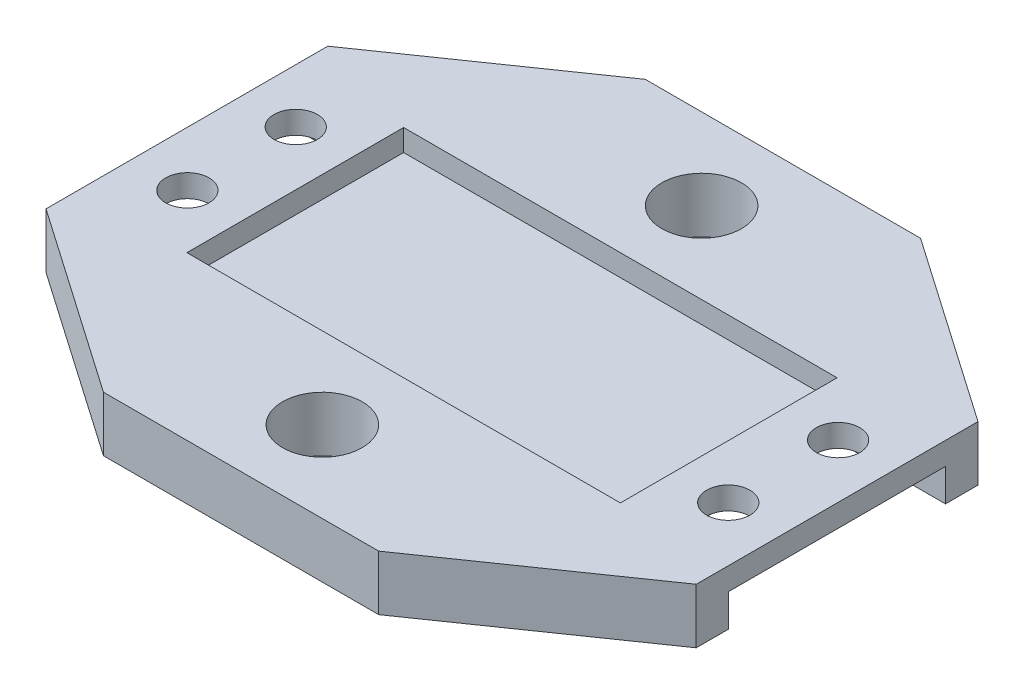
ISO-10303-21;
HEADER;
FILE_DESCRIPTION(('STEP AP214'),'2;1');
FILE_NAME('part.step','',(''),(''),'','','');
FILE_SCHEMA(('AUTOMOTIVE_DESIGN { 1 0 10303 214 1 1 1 1 }'));
ENDSEC;
DATA;
#1=APPLICATION_CONTEXT('core data for automotive mechanical design processes');
#2=APPLICATION_PROTOCOL_DEFINITION('international standard','automotive_design',2000,#1);
#3=PRODUCT_CONTEXT('',#1,'mechanical');
#4=PRODUCT('Part','Part','',(#3));
#5=PRODUCT_RELATED_PRODUCT_CATEGORY('part','',(#4));
#6=PRODUCT_DEFINITION_FORMATION('','',#4);
#7=PRODUCT_DEFINITION_CONTEXT('part definition',#1,'design');
#8=PRODUCT_DEFINITION('design','',#6,#7);
#9=PRODUCT_DEFINITION_SHAPE('','',#8);
#10=(LENGTH_UNIT() NAMED_UNIT(*) SI_UNIT(.MILLI.,.METRE.));
#11=(NAMED_UNIT(*) PLANE_ANGLE_UNIT() SI_UNIT($,.RADIAN.));
#12=(NAMED_UNIT(*) SI_UNIT($,.STERADIAN.) SOLID_ANGLE_UNIT());
#13=UNCERTAINTY_MEASURE_WITH_UNIT(LENGTH_MEASURE(1.E-05),#10,'distance_accuracy_value','');
#14=(GEOMETRIC_REPRESENTATION_CONTEXT(3) GLOBAL_UNCERTAINTY_ASSIGNED_CONTEXT((#13)) GLOBAL_UNIT_ASSIGNED_CONTEXT((#10,
#11,#12)) REPRESENTATION_CONTEXT('',''));
#15=CARTESIAN_POINT('',(0.,0.,0.));
#16=DIRECTION('',(0.,0.,1.));
#17=DIRECTION('',(1.,0.,0.));
#18=AXIS2_PLACEMENT_3D('',#15,#16,#17);
#19=CARTESIAN_POINT('',(-48.0586840471915,5.08,-27.2267854013535));
#20=DIRECTION('',(1.,0.,0.));
#21=DIRECTION('',(0.,0.,-1.));
#22=AXIS2_PLACEMENT_3D('',#19,#20,#21);
#23=PLANE('',#22);
#24=DIRECTION('',(0.,0.,-1.));
#25=VECTOR('',#24,1.);
#26=CARTESIAN_POINT('',(-48.0586840471915,3.,7.81499333051671));
#27=LINE('',#26,#25);
#28=CARTESIAN_POINT('',(-48.0586840471915,3.,7.81499333051671));
#29=VERTEX_POINT('',#28);
#30=CARTESIAN_POINT('',(-48.0586840471915,3.,-12.1850066694833));
#31=VERTEX_POINT('',#30);
#32=EDGE_CURVE('E257',#29,#31,#27,.T.);
#33=ORIENTED_EDGE('',*,*,#32,.F.);
#34=DIRECTION('',(0.,1.,0.));
#35=VECTOR('',#34,1.);
#36=CARTESIAN_POINT('',(-48.0586840471915,0.,7.81499333051671));
#37=LINE('',#36,#35);
#38=CARTESIAN_POINT('',(-48.0586840471915,0.,7.81499333051671));
#39=VERTEX_POINT('',#38);
#40=EDGE_CURVE('E235',#39,#29,#37,.T.);
#41=ORIENTED_EDGE('',*,*,#40,.F.);
#42=DIRECTION('',(0.,0.,1.));
#43=VECTOR('',#42,1.);
#44=CARTESIAN_POINT('',(-48.0586840471915,0.,-27.2267854013535));
#45=LINE('',#44,#43);
#46=CARTESIAN_POINT('',(-48.0586840471915,0.,10.7732145986465));
#47=VERTEX_POINT('',#46);
#48=EDGE_CURVE('E319',#39,#47,#45,.T.);
#49=ORIENTED_EDGE('',*,*,#48,.T.);
#50=DIRECTION('',(0.,1.,0.));
#51=VECTOR('',#50,1.);
#52=CARTESIAN_POINT('',(-48.0586840471915,0.,10.7732145986465));
#53=LINE('',#52,#51);
#54=CARTESIAN_POINT('',(-48.0586840471915,5.08,10.7732145986465));
#55=VERTEX_POINT('',#54);
#56=EDGE_CURVE('E306',#47,#55,#53,.T.);
#57=ORIENTED_EDGE('',*,*,#56,.T.);
#58=DIRECTION('',(0.,0.,1.));
#59=VECTOR('',#58,1.);
#60=CARTESIAN_POINT('',(-48.0586840471915,5.08,-27.2267854013535));
#61=LINE('',#60,#59);
#62=CARTESIAN_POINT('',(-48.0586840471915,5.08,-15.2267854013535));
#63=VERTEX_POINT('',#62);
#64=EDGE_CURVE('E322',#63,#55,#61,.T.);
#65=ORIENTED_EDGE('',*,*,#64,.F.);
#66=DIRECTION('',(0.,1.,0.));
#67=VECTOR('',#66,1.);
#68=CARTESIAN_POINT('',(-48.0586840471915,0.,-15.2267854013535));
#69=LINE('',#68,#67);
#70=CARTESIAN_POINT('',(-48.0586840471915,0.,-15.2267854013535));
#71=VERTEX_POINT('',#70);
#72=EDGE_CURVE('E279',#71,#63,#69,.T.);
#73=ORIENTED_EDGE('',*,*,#72,.F.);
#74=CARTESIAN_POINT('',(-48.0586840471915,0.,-12.1850066694833));
#75=VERTEX_POINT('',#74);
#76=EDGE_CURVE('E331',#71,#75,#45,.T.);
#77=ORIENTED_EDGE('',*,*,#76,.T.);
#78=DIRECTION('',(0.,-1.,0.));
#79=VECTOR('',#78,1.);
#80=CARTESIAN_POINT('',(-48.0586840471915,0.,-12.1850066694833));
#81=LINE('',#80,#79);
#82=EDGE_CURVE('E246',#31,#75,#81,.T.);
#83=ORIENTED_EDGE('',*,*,#82,.F.);
#84=EDGE_LOOP('',(#33,#41,#49,#57,#65,#73,#77,#83));
#85=FACE_BOUND('',#84,.T.);
#86=ADVANCED_FACE('F34',(#85),#23,.F.);
#87=CARTESIAN_POINT('',(-48.0586840471915,5.08,22.7732145986465));
#88=DIRECTION('',(0.,0.,-1.));
#89=DIRECTION('',(-1.,0.,0.));
#90=AXIS2_PLACEMENT_3D('',#87,#88,#89);
#91=PLANE('',#90);
#92=DIRECTION('',(0.,1.,0.));
#93=VECTOR('',#92,1.);
#94=CARTESIAN_POINT('',(-5.35868404719149,0.,22.7732145986465));
#95=LINE('',#94,#93);
#96=CARTESIAN_POINT('',(-5.3586840471915,0.,22.7732145986465));
#97=VERTEX_POINT('',#96);
#98=CARTESIAN_POINT('',(-5.35868404719149,5.08,22.7732145986465));
#99=VERTEX_POINT('',#98);
#100=EDGE_CURVE('E301',#97,#99,#95,.T.);
#101=ORIENTED_EDGE('',*,*,#100,.T.);
#102=DIRECTION('',(1.,0.,0.));
#103=VECTOR('',#102,1.);
#104=CARTESIAN_POINT('',(-48.0586840471915,5.08,22.7732145986465));
#105=LINE('',#104,#103);
#106=CARTESIAN_POINT('',(-30.7586840471915,5.08,22.7732145986465));
#107=VERTEX_POINT('',#106);
#108=EDGE_CURVE('E325',#107,#99,#105,.T.);
#109=ORIENTED_EDGE('',*,*,#108,.F.);
#110=DIRECTION('',(0.,1.,0.));
#111=VECTOR('',#110,1.);
#112=CARTESIAN_POINT('',(-30.7586840471915,0.,22.7732145986465));
#113=LINE('',#112,#111);
#114=CARTESIAN_POINT('',(-30.7586840471915,0.,22.7732145986465));
#115=VERTEX_POINT('',#114);
#116=EDGE_CURVE('E304',#115,#107,#113,.T.);
#117=ORIENTED_EDGE('',*,*,#116,.F.);
#118=DIRECTION('',(1.,0.,0.));
#119=VECTOR('',#118,1.);
#120=CARTESIAN_POINT('',(-48.0586840471915,0.,22.7732145986465));
#121=LINE('',#120,#119);
#122=EDGE_CURVE('E334',#115,#97,#121,.T.);
#123=ORIENTED_EDGE('',*,*,#122,.T.);
#124=EDGE_LOOP('',(#101,#109,#117,#123));
#125=FACE_BOUND('',#124,.T.);
#126=ADVANCED_FACE('F409',(#125),#91,.F.);
#127=CARTESIAN_POINT('',(11.9413159528085,5.08,-27.2267854013535));
#128=DIRECTION('',(-1.,0.,0.));
#129=DIRECTION('',(0.,0.,1.));
#130=AXIS2_PLACEMENT_3D('',#127,#128,#129);
#131=PLANE('',#130);
#132=DIRECTION('',(0.,0.,1.));
#133=VECTOR('',#132,1.);
#134=CARTESIAN_POINT('',(11.9413159528085,3.,-12.2267854013535));
#135=LINE('',#134,#133);
#136=CARTESIAN_POINT('',(11.9413159528085,3.,-12.2267854013535));
#137=VERTEX_POINT('',#136);
#138=CARTESIAN_POINT('',(11.9413159528085,3.,7.77321459864652));
#139=VERTEX_POINT('',#138);
#140=EDGE_CURVE('E229',#137,#139,#135,.T.);
#141=ORIENTED_EDGE('',*,*,#140,.F.);
#142=DIRECTION('',(0.,1.,0.));
#143=VECTOR('',#142,1.);
#144=CARTESIAN_POINT('',(11.9413159528085,0.,-12.2267854013535));
#145=LINE('',#144,#143);
#146=CARTESIAN_POINT('',(11.9413159528085,0.,-12.2267854013535));
#147=VERTEX_POINT('',#146);
#148=EDGE_CURVE('E213',#147,#137,#145,.T.);
#149=ORIENTED_EDGE('',*,*,#148,.F.);
#150=DIRECTION('',(0.,0.,-1.));
#151=VECTOR('',#150,1.);
#152=CARTESIAN_POINT('',(11.9413159528085,0.,-27.2267854013535));
#153=LINE('',#152,#151);
#154=CARTESIAN_POINT('',(11.9413159528085,0.,-15.2267854013535));
#155=VERTEX_POINT('',#154);
#156=EDGE_CURVE('E337',#147,#155,#153,.T.);
#157=ORIENTED_EDGE('',*,*,#156,.T.);
#158=DIRECTION('',(0.,1.,0.));
#159=VECTOR('',#158,1.);
#160=CARTESIAN_POINT('',(11.9413159528085,0.,-15.2267854013535));
#161=LINE('',#160,#159);
#162=CARTESIAN_POINT('',(11.9413159528085,5.08,-15.2267854013535));
#163=VERTEX_POINT('',#162);
#164=EDGE_CURVE('E296',#155,#163,#161,.T.);
#165=ORIENTED_EDGE('',*,*,#164,.T.);
#166=DIRECTION('',(0.,0.,-1.));
#167=VECTOR('',#166,1.);
#168=CARTESIAN_POINT('',(11.9413159528085,5.08,-27.2267854013535));
#169=LINE('',#168,#167);
#170=CARTESIAN_POINT('',(11.9413159528085,5.08,10.7732145986465));
#171=VERTEX_POINT('',#170);
#172=EDGE_CURVE('E42',#171,#163,#169,.T.);
#173=ORIENTED_EDGE('',*,*,#172,.F.);
#174=DIRECTION('',(0.,1.,0.));
#175=VECTOR('',#174,1.);
#176=CARTESIAN_POINT('',(11.9413159528085,0.,10.7732145986465));
#177=LINE('',#176,#175);
#178=CARTESIAN_POINT('',(11.9413159528085,0.,10.7732145986465));
#179=VERTEX_POINT('',#178);
#180=EDGE_CURVE('E299',#179,#171,#177,.T.);
#181=ORIENTED_EDGE('',*,*,#180,.F.);
#182=CARTESIAN_POINT('',(11.9413159528085,0.,7.77321459864652));
#183=VERTEX_POINT('',#182);
#184=EDGE_CURVE('E338',#179,#183,#153,.T.);
#185=ORIENTED_EDGE('',*,*,#184,.T.);
#186=DIRECTION('',(0.,-1.,0.));
#187=VECTOR('',#186,1.);
#188=CARTESIAN_POINT('',(11.9413159528085,0.,7.77321459864652));
#189=LINE('',#188,#187);
#190=EDGE_CURVE('E221',#139,#183,#189,.T.);
#191=ORIENTED_EDGE('',*,*,#190,.F.);
#192=EDGE_LOOP('',(#141,#149,#157,#165,#173,#181,#185,#191));
#193=FACE_BOUND('',#192,.T.);
#194=ADVANCED_FACE('F421',(#193),#131,.F.);
#195=CARTESIAN_POINT('',(-48.0586840471915,5.08,-27.2267854013535));
#196=DIRECTION('',(0.,0.,1.));
#197=DIRECTION('',(1.,0.,0.));
#198=AXIS2_PLACEMENT_3D('',#195,#196,#197);
#199=PLANE('',#198);
#200=DIRECTION('',(0.,1.,0.));
#201=VECTOR('',#200,1.);
#202=CARTESIAN_POINT('',(-30.7586840471915,0.,-27.2267854013535));
#203=LINE('',#202,#201);
#204=CARTESIAN_POINT('',(-30.7586840471915,0.,-27.2267854013535));
#205=VERTEX_POINT('',#204);
#206=CARTESIAN_POINT('',(-30.7586840471915,5.08,-27.2267854013535));
#207=VERTEX_POINT('',#206);
#208=EDGE_CURVE('E290',#205,#207,#203,.T.);
#209=ORIENTED_EDGE('',*,*,#208,.T.);
#210=DIRECTION('',(-1.,0.,0.));
#211=VECTOR('',#210,1.);
#212=CARTESIAN_POINT('',(-48.0586840471915,5.08,-27.2267854013535));
#213=LINE('',#212,#211);
#214=CARTESIAN_POINT('',(-5.35868404719149,5.08,-27.2267854013535));
#215=VERTEX_POINT('',#214);
#216=EDGE_CURVE('E12',#215,#207,#213,.T.);
#217=ORIENTED_EDGE('',*,*,#216,.F.);
#218=DIRECTION('',(0.,1.,0.));
#219=VECTOR('',#218,1.);
#220=CARTESIAN_POINT('',(-5.35868404719149,0.,-27.2267854013535));
#221=LINE('',#220,#219);
#222=CARTESIAN_POINT('',(-5.35868404719149,0.,-27.2267854013535));
#223=VERTEX_POINT('',#222);
#224=EDGE_CURVE('E294',#223,#215,#221,.T.);
#225=ORIENTED_EDGE('',*,*,#224,.F.);
#226=DIRECTION('',(-1.,0.,0.));
#227=VECTOR('',#226,1.);
#228=CARTESIAN_POINT('',(-48.0586840471915,0.,-27.2267854013535));
#229=LINE('',#228,#227);
#230=EDGE_CURVE('E326',#223,#205,#229,.T.);
#231=ORIENTED_EDGE('',*,*,#230,.T.);
#232=EDGE_LOOP('',(#209,#217,#225,#231));
#233=FACE_BOUND('',#232,.T.);
#234=ADVANCED_FACE('F371',(#233),#199,.F.);
#235=CARTESIAN_POINT('',(0.,5.08,0.));
#236=DIRECTION('',(0.,1.,0.));
#237=DIRECTION('',(0.,0.,1.));
#238=AXIS2_PLACEMENT_3D('',#235,#236,#237);
#239=PLANE('',#238);
#240=CARTESIAN_POINT('',(6.8978187102266,5.08,2.77321459864652));
#241=DIRECTION('',(0.,1.,0.));
#242=DIRECTION('',(0.,0.,-1.));
#243=AXIS2_PLACEMENT_3D('',#240,#241,#242);
#244=CIRCLE('',#243,2.);
#245=CARTESIAN_POINT('',(6.8978187102266,5.08,0.773214598646517));
#246=VERTEX_POINT('',#245);
#247=EDGE_CURVE('E359',#246,#246,#244,.T.);
#248=ORIENTED_EDGE('',*,*,#247,.F.);
#249=EDGE_LOOP('',(#248));
#250=FACE_BOUND('',#249,.T.);
#251=CARTESIAN_POINT('',(6.96420054211394,5.08,-7.2928673810058));
#252=DIRECTION('',(0.,1.,0.));
#253=DIRECTION('',(0.,0.,1.));
#254=AXIS2_PLACEMENT_3D('',#251,#252,#253);
#255=CIRCLE('',#254,2.00000000000001);
#256=CARTESIAN_POINT('',(6.96420054211394,5.08,-5.29286738100579));
#257=VERTEX_POINT('',#256);
#258=EDGE_CURVE('E350',#257,#257,#255,.T.);
#259=ORIENTED_EDGE('',*,*,#258,.F.);
#260=EDGE_LOOP('',(#259));
#261=FACE_BOUND('',#260,.T.);
#262=CARTESIAN_POINT('',(-43.0815686364969,5.08,-7.2928673810058));
#263=DIRECTION('',(0.,1.,0.));
#264=DIRECTION('',(0.,0.,-1.));
#265=AXIS2_PLACEMENT_3D('',#262,#263,#264);
#266=CIRCLE('',#265,2.00000000000001);
#267=CARTESIAN_POINT('',(-43.0815686364969,5.08,-9.29286738100581));
#268=VERTEX_POINT('',#267);
#269=EDGE_CURVE('E347',#268,#268,#266,.T.);
#270=ORIENTED_EDGE('',*,*,#269,.F.);
#271=EDGE_LOOP('',(#270));
#272=FACE_BOUND('',#271,.T.);
#273=CARTESIAN_POINT('',(-43.0151868046096,5.08,2.77321459864652));
#274=DIRECTION('',(0.,1.,0.));
#275=DIRECTION('',(0.,0.,1.));
#276=AXIS2_PLACEMENT_3D('',#273,#274,#275);
#277=CIRCLE('',#276,2.);
#278=CARTESIAN_POINT('',(-43.0151868046096,5.08,4.77321459864652));
#279=VERTEX_POINT('',#278);
#280=EDGE_CURVE('E200',#279,#279,#277,.T.);
#281=ORIENTED_EDGE('',*,*,#280,.F.);
#282=EDGE_LOOP('',(#281));
#283=FACE_BOUND('',#282,.T.);
#284=DIRECTION('',(0.,0.,-1.));
#285=VECTOR('',#284,1.);
#286=CARTESIAN_POINT('',(1.94131595280851,5.08,7.77321459864652));
#287=LINE('',#286,#285);
#288=CARTESIAN_POINT('',(1.94131595280851,5.08,7.77321459864652));
#289=VERTEX_POINT('',#288);
#290=CARTESIAN_POINT('',(1.94131595280851,5.08,-12.2267854013535));
#291=VERTEX_POINT('',#290);
#292=EDGE_CURVE('E50',#289,#291,#287,.T.);
#293=ORIENTED_EDGE('',*,*,#292,.F.);
#294=DIRECTION('',(1.,0.,0.));
#295=VECTOR('',#294,1.);
#296=CARTESIAN_POINT('',(-38.0586840471915,5.08,7.77321459864652));
#297=LINE('',#296,#295);
#298=CARTESIAN_POINT('',(-38.0586840471915,5.08,7.77321459864652));
#299=VERTEX_POINT('',#298);
#300=EDGE_CURVE('E194',#299,#289,#297,.T.);
#301=ORIENTED_EDGE('',*,*,#300,.F.);
#302=DIRECTION('',(0.,0.,1.));
#303=VECTOR('',#302,1.);
#304=CARTESIAN_POINT('',(-38.0586840471915,5.08,7.77321459864652));
#305=LINE('',#304,#303);
#306=CARTESIAN_POINT('',(-38.0586840471915,5.08,-12.2267854013535));
#307=VERTEX_POINT('',#306);
#308=EDGE_CURVE('E197',#307,#299,#305,.T.);
#309=ORIENTED_EDGE('',*,*,#308,.F.);
#310=DIRECTION('',(-1.,0.,0.));
#311=VECTOR('',#310,1.);
#312=CARTESIAN_POINT('',(-38.0586840471915,5.08,-12.2267854013535));
#313=LINE('',#312,#311);
#314=EDGE_CURVE('E206',#291,#307,#313,.T.);
#315=ORIENTED_EDGE('',*,*,#314,.F.);
#316=EDGE_LOOP('',(#293,#301,#309,#315));
#317=FACE_BOUND('',#316,.T.);
#318=CARTESIAN_POINT('',(-18.0586840471915,5.08,15.2732145986465));
#319=DIRECTION('',(0.,1.,0.));
#320=DIRECTION('',(0.,0.,-1.));
#321=AXIS2_PLACEMENT_3D('',#318,#319,#320);
#322=CIRCLE('',#321,3.675);
#323=CARTESIAN_POINT('',(-18.0586840471915,5.08,11.5982145986465));
#324=VERTEX_POINT('',#323);
#325=EDGE_CURVE('E293',#324,#324,#322,.T.);
#326=ORIENTED_EDGE('',*,*,#325,.F.);
#327=EDGE_LOOP('',(#326));
#328=FACE_BOUND('',#327,.T.);
#329=CARTESIAN_POINT('',(-18.0586840471915,5.08,-19.7267854013535));
#330=DIRECTION('',(0.,1.,0.));
#331=DIRECTION('',(0.,0.,1.));
#332=AXIS2_PLACEMENT_3D('',#329,#330,#331);
#333=CIRCLE('',#332,3.675);
#334=CARTESIAN_POINT('',(-18.0586840471915,5.08,-16.0517854013535));
#335=VERTEX_POINT('',#334);
#336=EDGE_CURVE('E313',#335,#335,#333,.T.);
#337=ORIENTED_EDGE('',*,*,#336,.F.);
#338=EDGE_LOOP('',(#337));
#339=FACE_BOUND('',#338,.T.);
#340=ORIENTED_EDGE('',*,*,#216,.T.);
#341=DIRECTION('',(-0.821678902173455,0.,0.569950683588524));
#342=VECTOR('',#341,1.);
#343=CARTESIAN_POINT('',(-30.7586840471915,5.08,-27.2267854013535));
#344=LINE('',#343,#342);
#345=EDGE_CURVE('E263',#207,#63,#344,.T.);
#346=ORIENTED_EDGE('',*,*,#345,.T.);
#347=ORIENTED_EDGE('',*,*,#64,.T.);
#348=DIRECTION('',(0.821678902173455,0.,0.569950683588524));
#349=VECTOR('',#348,1.);
#350=CARTESIAN_POINT('',(-30.7586840471915,5.08,22.7732145986465));
#351=LINE('',#350,#349);
#352=EDGE_CURVE('E282',#55,#107,#351,.T.);
#353=ORIENTED_EDGE('',*,*,#352,.T.);
#354=ORIENTED_EDGE('',*,*,#108,.T.);
#355=DIRECTION('',(0.821678902173455,0.,-0.569950683588524));
#356=VECTOR('',#355,1.);
#357=CARTESIAN_POINT('',(-5.35868404719149,5.08,22.7732145986465));
#358=LINE('',#357,#356);
#359=EDGE_CURVE('E285',#99,#171,#358,.T.);
#360=ORIENTED_EDGE('',*,*,#359,.T.);
#361=ORIENTED_EDGE('',*,*,#172,.T.);
#362=DIRECTION('',(-0.821678902173455,0.,-0.569950683588524));
#363=VECTOR('',#362,1.);
#364=CARTESIAN_POINT('',(-5.35868404719149,5.08,-27.2267854013535));
#365=LINE('',#364,#363);
#366=EDGE_CURVE('E273',#163,#215,#365,.T.);
#367=ORIENTED_EDGE('',*,*,#366,.T.);
#368=EDGE_LOOP('',(#340,#346,#347,#353,#354,#360,#361,#367));
#369=FACE_BOUND('',#368,.T.);
#370=ADVANCED_FACE('F367',(#250,#261,#272,#283,#317,#328,#339,#369),#239,.T.);
#371=CARTESIAN_POINT('',(0.,0.,0.));
#372=DIRECTION('',(0.,1.,0.));
#373=DIRECTION('',(0.,0.,1.));
#374=AXIS2_PLACEMENT_3D('',#371,#372,#373);
#375=PLANE('',#374);
#376=ORIENTED_EDGE('',*,*,#156,.F.);
#377=DIRECTION('',(1.,0.,0.));
#378=VECTOR('',#377,1.);
#379=CARTESIAN_POINT('',(1.94131595280851,0.,-12.2267854013535));
#380=LINE('',#379,#378);
#381=CARTESIAN_POINT('',(1.94131595280851,0.,-12.2267854013535));
#382=VERTEX_POINT('',#381);
#383=EDGE_CURVE('E233',#382,#147,#380,.T.);
#384=ORIENTED_EDGE('',*,*,#383,.F.);
#385=DIRECTION('',(0.,0.,-1.));
#386=VECTOR('',#385,1.);
#387=CARTESIAN_POINT('',(1.94131595280851,0.,-12.2267854013535));
#388=LINE('',#387,#386);
#389=CARTESIAN_POINT('',(1.94131595280851,0.,7.77321459864652));
#390=VERTEX_POINT('',#389);
#391=EDGE_CURVE('E224',#390,#382,#388,.T.);
#392=ORIENTED_EDGE('',*,*,#391,.F.);
#393=DIRECTION('',(1.,0.,0.));
#394=VECTOR('',#393,1.);
#395=CARTESIAN_POINT('',(1.94131595280851,0.,7.77321459864652));
#396=LINE('',#395,#394);
#397=EDGE_CURVE('E236',#390,#183,#396,.T.);
#398=ORIENTED_EDGE('',*,*,#397,.T.);
#399=ORIENTED_EDGE('',*,*,#184,.F.);
#400=DIRECTION('',(0.821678902173455,0.,-0.569950683588524));
#401=VECTOR('',#400,1.);
#402=CARTESIAN_POINT('',(-5.35868404719149,0.,22.7732145986465));
#403=LINE('',#402,#401);
#404=EDGE_CURVE('E275',#97,#179,#403,.T.);
#405=ORIENTED_EDGE('',*,*,#404,.F.);
#406=ORIENTED_EDGE('',*,*,#122,.F.);
#407=DIRECTION('',(0.821678902173455,0.,0.569950683588524));
#408=VECTOR('',#407,1.);
#409=CARTESIAN_POINT('',(-30.7586840471915,0.,22.7732145986465));
#410=LINE('',#409,#408);
#411=EDGE_CURVE('E272',#47,#115,#410,.T.);
#412=ORIENTED_EDGE('',*,*,#411,.F.);
#413=ORIENTED_EDGE('',*,*,#48,.F.);
#414=DIRECTION('',(-1.,0.,0.));
#415=VECTOR('',#414,1.);
#416=CARTESIAN_POINT('',(-38.0586840471915,0.,7.81499333051671));
#417=LINE('',#416,#415);
#418=CARTESIAN_POINT('',(-38.0586840471915,0.,7.81499333051671));
#419=VERTEX_POINT('',#418);
#420=EDGE_CURVE('E261',#419,#39,#417,.T.);
#421=ORIENTED_EDGE('',*,*,#420,.F.);
#422=DIRECTION('',(0.,0.,1.));
#423=VECTOR('',#422,1.);
#424=CARTESIAN_POINT('',(-38.0586840471915,0.,7.81499333051671));
#425=LINE('',#424,#423);
#426=CARTESIAN_POINT('',(-38.0586840471915,0.,-12.1850066694833));
#427=VERTEX_POINT('',#426);
#428=EDGE_CURVE('E251',#427,#419,#425,.T.);
#429=ORIENTED_EDGE('',*,*,#428,.F.);
#430=DIRECTION('',(-1.,0.,0.));
#431=VECTOR('',#430,1.);
#432=CARTESIAN_POINT('',(-38.0586840471915,0.,-12.1850066694833));
#433=LINE('',#432,#431);
#434=EDGE_CURVE('E264',#427,#75,#433,.T.);
#435=ORIENTED_EDGE('',*,*,#434,.T.);
#436=ORIENTED_EDGE('',*,*,#76,.F.);
#437=DIRECTION('',(-0.821678902173455,0.,0.569950683588524));
#438=VECTOR('',#437,1.);
#439=CARTESIAN_POINT('',(-30.7586840471915,0.,-27.2267854013535));
#440=LINE('',#439,#438);
#441=EDGE_CURVE('E270',#205,#71,#440,.T.);
#442=ORIENTED_EDGE('',*,*,#441,.F.);
#443=ORIENTED_EDGE('',*,*,#230,.F.);
#444=DIRECTION('',(-0.821678902173455,0.,-0.569950683588524));
#445=VECTOR('',#444,1.);
#446=CARTESIAN_POINT('',(-5.35868404719149,0.,-27.2267854013535));
#447=LINE('',#446,#445);
#448=EDGE_CURVE('E277',#155,#223,#447,.T.);
#449=ORIENTED_EDGE('',*,*,#448,.F.);
#450=EDGE_LOOP('',(#376,#384,#392,#398,#399,#405,#406,#412,#413,#421,#429,#435,#436,#442,#443,#449));
#451=FACE_BOUND('',#450,.T.);
#452=CARTESIAN_POINT('',(-18.0586840471915,0.,15.2732145986465));
#453=DIRECTION('',(0.,1.,0.));
#454=DIRECTION('',(0.,0.,-1.));
#455=AXIS2_PLACEMENT_3D('',#452,#453,#454);
#456=CIRCLE('',#455,3.675);
#457=CARTESIAN_POINT('',(-18.0586840471915,0.,11.5982145986465));
#458=VERTEX_POINT('',#457);
#459=EDGE_CURVE('E310',#458,#458,#456,.T.);
#460=ORIENTED_EDGE('',*,*,#459,.T.);
#461=EDGE_LOOP('',(#460));
#462=FACE_BOUND('',#461,.T.);
#463=CARTESIAN_POINT('',(-18.0586840471915,0.,-19.7267854013535));
#464=DIRECTION('',(0.,1.,0.));
#465=DIRECTION('',(0.,0.,1.));
#466=AXIS2_PLACEMENT_3D('',#463,#464,#465);
#467=CIRCLE('',#466,3.675);
#468=CARTESIAN_POINT('',(-18.0586840471915,0.,-16.0517854013535));
#469=VERTEX_POINT('',#468);
#470=EDGE_CURVE('E316',#469,#469,#467,.T.);
#471=ORIENTED_EDGE('',*,*,#470,.T.);
#472=EDGE_LOOP('',(#471));
#473=FACE_BOUND('',#472,.T.);
#474=ADVANCED_FACE('F370',(#451,#462,#473),#375,.F.);
#475=CARTESIAN_POINT('',(-18.0586840471915,0.,-19.7267854013535));
#476=DIRECTION('',(0.,1.,0.));
#477=DIRECTION('',(0.,0.,1.));
#478=AXIS2_PLACEMENT_3D('',#475,#476,#477);
#479=CYLINDRICAL_SURFACE('',#478,3.675);
#480=ORIENTED_EDGE('',*,*,#470,.F.);
#481=EDGE_LOOP('',(#480));
#482=FACE_BOUND('',#481,.T.);
#483=ORIENTED_EDGE('',*,*,#336,.T.);
#484=EDGE_LOOP('',(#483));
#485=FACE_BOUND('',#484,.T.);
#486=ADVANCED_FACE('F458',(#482,#485),#479,.F.);
#487=CARTESIAN_POINT('',(-18.0586840471915,0.,15.2732145986465));
#488=DIRECTION('',(0.,1.,0.));
#489=DIRECTION('',(0.,0.,1.));
#490=AXIS2_PLACEMENT_3D('',#487,#488,#489);
#491=CYLINDRICAL_SURFACE('',#490,3.675);
#492=ORIENTED_EDGE('',*,*,#459,.F.);
#493=EDGE_LOOP('',(#492));
#494=FACE_BOUND('',#493,.T.);
#495=ORIENTED_EDGE('',*,*,#325,.T.);
#496=EDGE_LOOP('',(#495));
#497=FACE_BOUND('',#496,.T.);
#498=ADVANCED_FACE('F462',(#494,#497),#491,.F.);
#499=CARTESIAN_POINT('',(-30.7586840471915,0.,22.7732145986465));
#500=DIRECTION('',(-0.569950683588524,0.,0.821678902173455));
#501=DIRECTION('',(0.821678902173455,0.,0.569950683588524));
#502=AXIS2_PLACEMENT_3D('',#499,#500,#501);
#503=PLANE('',#502);
#504=ORIENTED_EDGE('',*,*,#352,.F.);
#505=ORIENTED_EDGE('',*,*,#56,.F.);
#506=ORIENTED_EDGE('',*,*,#411,.T.);
#507=ORIENTED_EDGE('',*,*,#116,.T.);
#508=EDGE_LOOP('',(#504,#505,#506,#507));
#509=FACE_BOUND('',#508,.T.);
#510=ADVANCED_FACE('F466',(#509),#503,.T.);
#511=CARTESIAN_POINT('',(-5.35868404719149,0.,22.7732145986465));
#512=DIRECTION('',(0.569950683588524,0.,0.821678902173455));
#513=DIRECTION('',(0.821678902173455,0.,-0.569950683588525));
#514=AXIS2_PLACEMENT_3D('',#511,#512,#513);
#515=PLANE('',#514);
#516=ORIENTED_EDGE('',*,*,#359,.F.);
#517=ORIENTED_EDGE('',*,*,#100,.F.);
#518=ORIENTED_EDGE('',*,*,#404,.T.);
#519=ORIENTED_EDGE('',*,*,#180,.T.);
#520=EDGE_LOOP('',(#516,#517,#518,#519));
#521=FACE_BOUND('',#520,.T.);
#522=ADVANCED_FACE('F413',(#521),#515,.T.);
#523=CARTESIAN_POINT('',(-5.35868404719149,0.,-27.2267854013535));
#524=DIRECTION('',(0.569950683588524,0.,-0.821678902173455));
#525=DIRECTION('',(-0.821678902173455,0.,-0.569950683588524));
#526=AXIS2_PLACEMENT_3D('',#523,#524,#525);
#527=PLANE('',#526);
#528=ORIENTED_EDGE('',*,*,#366,.F.);
#529=ORIENTED_EDGE('',*,*,#164,.F.);
#530=ORIENTED_EDGE('',*,*,#448,.T.);
#531=ORIENTED_EDGE('',*,*,#224,.T.);
#532=EDGE_LOOP('',(#528,#529,#530,#531));
#533=FACE_BOUND('',#532,.T.);
#534=ADVANCED_FACE('F426',(#533),#527,.T.);
#535=CARTESIAN_POINT('',(-30.7586840471915,0.,-27.2267854013535));
#536=DIRECTION('',(-0.569950683588524,0.,-0.821678902173455));
#537=DIRECTION('',(-0.821678902173455,0.,0.569950683588524));
#538=AXIS2_PLACEMENT_3D('',#535,#536,#537);
#539=PLANE('',#538);
#540=ORIENTED_EDGE('',*,*,#345,.F.);
#541=ORIENTED_EDGE('',*,*,#208,.F.);
#542=ORIENTED_EDGE('',*,*,#441,.T.);
#543=ORIENTED_EDGE('',*,*,#72,.T.);
#544=EDGE_LOOP('',(#540,#541,#542,#543));
#545=FACE_BOUND('',#544,.T.);
#546=ADVANCED_FACE('F392',(#545),#539,.T.);
#547=CARTESIAN_POINT('',(-38.0586840471915,0.,7.81499333051671));
#548=DIRECTION('',(0.,0.,1.));
#549=DIRECTION('',(1.,0.,0.));
#550=AXIS2_PLACEMENT_3D('',#547,#548,#549);
#551=PLANE('',#550);
#552=ORIENTED_EDGE('',*,*,#40,.T.);
#553=DIRECTION('',(-1.,0.,0.));
#554=VECTOR('',#553,1.);
#555=CARTESIAN_POINT('',(-38.0586840471915,3.,7.81499333051671));
#556=LINE('',#555,#554);
#557=CARTESIAN_POINT('',(-38.0586840471915,3.,7.81499333051671));
#558=VERTEX_POINT('',#557);
#559=EDGE_CURVE('E254',#558,#29,#556,.T.);
#560=ORIENTED_EDGE('',*,*,#559,.F.);
#561=DIRECTION('',(0.,1.,0.));
#562=VECTOR('',#561,1.);
#563=CARTESIAN_POINT('',(-38.0586840471915,0.,7.81499333051671));
#564=LINE('',#563,#562);
#565=EDGE_CURVE('E242',#419,#558,#564,.T.);
#566=ORIENTED_EDGE('',*,*,#565,.F.);
#567=ORIENTED_EDGE('',*,*,#420,.T.);
#568=EDGE_LOOP('',(#552,#560,#566,#567));
#569=FACE_BOUND('',#568,.T.);
#570=ADVANCED_FACE('F470',(#569),#551,.F.);
#571=CARTESIAN_POINT('',(-38.0586840471915,0.,-12.1850066694833));
#572=DIRECTION('',(0.,0.,-1.));
#573=DIRECTION('',(-1.,0.,0.));
#574=AXIS2_PLACEMENT_3D('',#571,#572,#573);
#575=PLANE('',#574);
#576=ORIENTED_EDGE('',*,*,#82,.T.);
#577=ORIENTED_EDGE('',*,*,#434,.F.);
#578=DIRECTION('',(0.,-1.,0.));
#579=VECTOR('',#578,1.);
#580=CARTESIAN_POINT('',(-38.0586840471915,0.,-12.1850066694833));
#581=LINE('',#580,#579);
#582=CARTESIAN_POINT('',(-38.0586840471915,3.,-12.1850066694833));
#583=VERTEX_POINT('',#582);
#584=EDGE_CURVE('E249',#583,#427,#581,.T.);
#585=ORIENTED_EDGE('',*,*,#584,.F.);
#586=DIRECTION('',(-1.,0.,0.));
#587=VECTOR('',#586,1.);
#588=CARTESIAN_POINT('',(-38.0586840471915,3.,-12.1850066694833));
#589=LINE('',#588,#587);
#590=EDGE_CURVE('E267',#583,#31,#589,.T.);
#591=ORIENTED_EDGE('',*,*,#590,.T.);
#592=EDGE_LOOP('',(#576,#577,#585,#591));
#593=FACE_BOUND('',#592,.T.);
#594=ADVANCED_FACE('F479',(#593),#575,.F.);
#595=CARTESIAN_POINT('',(-38.0586840471915,3.,7.81499333051671));
#596=DIRECTION('',(0.,1.,0.));
#597=DIRECTION('',(0.,0.,1.));
#598=AXIS2_PLACEMENT_3D('',#595,#596,#597);
#599=PLANE('',#598);
#600=CARTESIAN_POINT('',(-43.0815686364969,3.,-7.2928673810058));
#601=DIRECTION('',(0.,1.,0.));
#602=DIRECTION('',(0.,0.,1.));
#603=AXIS2_PLACEMENT_3D('',#600,#601,#602);
#604=CIRCLE('',#603,2.00000000000001);
#605=CARTESIAN_POINT('',(-43.0815686364969,3.,-5.29286738100579));
#606=VERTEX_POINT('',#605);
#607=EDGE_CURVE('E345',#606,#606,#604,.T.);
#608=ORIENTED_EDGE('',*,*,#607,.T.);
#609=EDGE_LOOP('',(#608));
#610=FACE_BOUND('',#609,.T.);
#611=CARTESIAN_POINT('',(-43.0151868046096,3.,2.77321459864652));
#612=DIRECTION('',(0.,1.,0.));
#613=DIRECTION('',(0.,0.,1.));
#614=AXIS2_PLACEMENT_3D('',#611,#612,#613);
#615=CIRCLE('',#614,2.);
#616=CARTESIAN_POINT('',(-43.0151868046096,3.,4.77321459864652));
#617=VERTEX_POINT('',#616);
#618=EDGE_CURVE('E207',#617,#617,#615,.T.);
#619=ORIENTED_EDGE('',*,*,#618,.T.);
#620=EDGE_LOOP('',(#619));
#621=FACE_BOUND('',#620,.T.);
#622=ORIENTED_EDGE('',*,*,#32,.T.);
#623=ORIENTED_EDGE('',*,*,#590,.F.);
#624=DIRECTION('',(0.,0.,-1.));
#625=VECTOR('',#624,1.);
#626=CARTESIAN_POINT('',(-38.0586840471915,3.,7.81499333051671));
#627=LINE('',#626,#625);
#628=EDGE_CURVE('E245',#558,#583,#627,.T.);
#629=ORIENTED_EDGE('',*,*,#628,.F.);
#630=ORIENTED_EDGE('',*,*,#559,.T.);
#631=EDGE_LOOP('',(#622,#623,#629,#630));
#632=FACE_BOUND('',#631,.T.);
#633=ADVANCED_FACE('F481',(#610,#621,#632),#599,.F.);
#634=CARTESIAN_POINT('',(-38.0586840471915,0.,0.));
#635=DIRECTION('',(-1.,0.,0.));
#636=DIRECTION('',(0.,0.,1.));
#637=AXIS2_PLACEMENT_3D('',#634,#635,#636);
#638=PLANE('',#637);
#639=ORIENTED_EDGE('',*,*,#565,.T.);
#640=ORIENTED_EDGE('',*,*,#628,.T.);
#641=ORIENTED_EDGE('',*,*,#584,.T.);
#642=ORIENTED_EDGE('',*,*,#428,.T.);
#643=EDGE_LOOP('',(#639,#640,#641,#642));
#644=FACE_BOUND('',#643,.T.);
#645=ADVANCED_FACE('F484',(#644),#638,.T.);
#646=CARTESIAN_POINT('',(1.94131595280851,0.,-12.2267854013535));
#647=DIRECTION('',(0.,0.,-1.));
#648=DIRECTION('',(-1.,0.,0.));
#649=AXIS2_PLACEMENT_3D('',#646,#647,#648);
#650=PLANE('',#649);
#651=ORIENTED_EDGE('',*,*,#148,.T.);
#652=DIRECTION('',(1.,0.,0.));
#653=VECTOR('',#652,1.);
#654=CARTESIAN_POINT('',(1.94131595280851,3.,-12.2267854013535));
#655=LINE('',#654,#653);
#656=CARTESIAN_POINT('',(1.94131595280851,3.,-12.2267854013535));
#657=VERTEX_POINT('',#656);
#658=EDGE_CURVE('E226',#657,#137,#655,.T.);
#659=ORIENTED_EDGE('',*,*,#658,.F.);
#660=DIRECTION('',(0.,1.,0.));
#661=VECTOR('',#660,1.);
#662=CARTESIAN_POINT('',(1.94131595280851,0.,-12.2267854013535));
#663=LINE('',#662,#661);
#664=EDGE_CURVE('E217',#382,#657,#663,.T.);
#665=ORIENTED_EDGE('',*,*,#664,.F.);
#666=ORIENTED_EDGE('',*,*,#383,.T.);
#667=EDGE_LOOP('',(#651,#659,#665,#666));
#668=FACE_BOUND('',#667,.T.);
#669=ADVANCED_FACE('F429',(#668),#650,.F.);
#670=CARTESIAN_POINT('',(1.94131595280851,0.,7.77321459864652));
#671=DIRECTION('',(0.,0.,1.));
#672=DIRECTION('',(1.,0.,0.));
#673=AXIS2_PLACEMENT_3D('',#670,#671,#672);
#674=PLANE('',#673);
#675=ORIENTED_EDGE('',*,*,#190,.T.);
#676=ORIENTED_EDGE('',*,*,#397,.F.);
#677=DIRECTION('',(0.,-1.,0.));
#678=VECTOR('',#677,1.);
#679=CARTESIAN_POINT('',(1.94131595280851,0.,7.77321459864652));
#680=LINE('',#679,#678);
#681=CARTESIAN_POINT('',(1.94131595280851,3.,7.77321459864652));
#682=VERTEX_POINT('',#681);
#683=EDGE_CURVE('E58',#682,#390,#680,.T.);
#684=ORIENTED_EDGE('',*,*,#683,.F.);
#685=DIRECTION('',(1.,0.,0.));
#686=VECTOR('',#685,1.);
#687=CARTESIAN_POINT('',(1.94131595280851,3.,7.77321459864652));
#688=LINE('',#687,#686);
#689=EDGE_CURVE('E239',#682,#139,#688,.T.);
#690=ORIENTED_EDGE('',*,*,#689,.T.);
#691=EDGE_LOOP('',(#675,#676,#684,#690));
#692=FACE_BOUND('',#691,.T.);
#693=ADVANCED_FACE('F442',(#692),#674,.F.);
#694=CARTESIAN_POINT('',(1.94131595280851,3.,-12.2267854013535));
#695=DIRECTION('',(0.,1.,0.));
#696=DIRECTION('',(0.,0.,1.));
#697=AXIS2_PLACEMENT_3D('',#694,#695,#696);
#698=PLANE('',#697);
#699=CARTESIAN_POINT('',(6.8978187102266,3.,2.77321459864652));
#700=DIRECTION('',(0.,1.,0.));
#701=DIRECTION('',(0.,0.,1.));
#702=AXIS2_PLACEMENT_3D('',#699,#700,#701);
#703=CIRCLE('',#702,2.);
#704=CARTESIAN_POINT('',(6.8978187102266,3.,4.77321459864652));
#705=VERTEX_POINT('',#704);
#706=EDGE_CURVE('E37',#705,#705,#703,.T.);
#707=ORIENTED_EDGE('',*,*,#706,.T.);
#708=EDGE_LOOP('',(#707));
#709=FACE_BOUND('',#708,.T.);
#710=CARTESIAN_POINT('',(6.96420054211394,3.,-7.2928673810058));
#711=DIRECTION('',(0.,1.,0.));
#712=DIRECTION('',(0.,0.,1.));
#713=AXIS2_PLACEMENT_3D('',#710,#711,#712);
#714=CIRCLE('',#713,2.00000000000001);
#715=CARTESIAN_POINT('',(6.96420054211394,3.,-5.29286738100579));
#716=VERTEX_POINT('',#715);
#717=EDGE_CURVE('E348',#716,#716,#714,.T.);
#718=ORIENTED_EDGE('',*,*,#717,.T.);
#719=EDGE_LOOP('',(#718));
#720=FACE_BOUND('',#719,.T.);
#721=ORIENTED_EDGE('',*,*,#140,.T.);
#722=ORIENTED_EDGE('',*,*,#689,.F.);
#723=DIRECTION('',(0.,0.,1.));
#724=VECTOR('',#723,1.);
#725=CARTESIAN_POINT('',(1.94131595280851,3.,-12.2267854013535));
#726=LINE('',#725,#724);
#727=EDGE_CURVE('E220',#657,#682,#726,.T.);
#728=ORIENTED_EDGE('',*,*,#727,.F.);
#729=ORIENTED_EDGE('',*,*,#658,.T.);
#730=EDGE_LOOP('',(#721,#722,#728,#729));
#731=FACE_BOUND('',#730,.T.);
#732=ADVANCED_FACE('F431',(#709,#720,#731),#698,.F.);
#733=CARTESIAN_POINT('',(1.94131595280851,0.,0.));
#734=DIRECTION('',(1.,0.,0.));
#735=DIRECTION('',(0.,0.,-1.));
#736=AXIS2_PLACEMENT_3D('',#733,#734,#735);
#737=PLANE('',#736);
#738=ORIENTED_EDGE('',*,*,#664,.T.);
#739=ORIENTED_EDGE('',*,*,#727,.T.);
#740=ORIENTED_EDGE('',*,*,#683,.T.);
#741=ORIENTED_EDGE('',*,*,#391,.T.);
#742=EDGE_LOOP('',(#738,#739,#740,#741));
#743=FACE_BOUND('',#742,.T.);
#744=ADVANCED_FACE('F433',(#743),#737,.T.);
#745=CARTESIAN_POINT('',(1.94131595280851,3.08,7.77321459864652));
#746=DIRECTION('',(1.,0.,0.));
#747=DIRECTION('',(0.,0.,-1.));
#748=AXIS2_PLACEMENT_3D('',#745,#746,#747);
#749=PLANE('',#748);
#750=ORIENTED_EDGE('',*,*,#292,.T.);
#751=DIRECTION('',(0.,1.,0.));
#752=VECTOR('',#751,1.);
#753=CARTESIAN_POINT('',(1.94131595280851,3.08,-12.2267854013535));
#754=LINE('',#753,#752);
#755=CARTESIAN_POINT('',(1.94131595280851,3.08,-12.2267854013535));
#756=VERTEX_POINT('',#755);
#757=EDGE_CURVE('E172',#756,#291,#754,.T.);
#758=ORIENTED_EDGE('',*,*,#757,.F.);
#759=DIRECTION('',(0.,0.,-1.));
#760=VECTOR('',#759,1.);
#761=CARTESIAN_POINT('',(1.94131595280851,3.08,7.77321459864652));
#762=LINE('',#761,#760);
#763=CARTESIAN_POINT('',(1.94131595280851,3.08,7.77321459864652));
#764=VERTEX_POINT('',#763);
#765=EDGE_CURVE('E176',#764,#756,#762,.T.);
#766=ORIENTED_EDGE('',*,*,#765,.F.);
#767=DIRECTION('',(0.,1.,0.));
#768=VECTOR('',#767,1.);
#769=CARTESIAN_POINT('',(1.94131595280851,3.08,7.77321459864652));
#770=LINE('',#769,#768);
#771=EDGE_CURVE('E211',#764,#289,#770,.T.);
#772=ORIENTED_EDGE('',*,*,#771,.T.);
#773=EDGE_LOOP('',(#750,#758,#766,#772));
#774=FACE_BOUND('',#773,.T.);
#775=ADVANCED_FACE('F174',(#774),#749,.F.);
#776=CARTESIAN_POINT('',(-38.0586840471915,3.08,7.77321459864652));
#777=DIRECTION('',(0.,0.,1.));
#778=DIRECTION('',(1.,0.,0.));
#779=AXIS2_PLACEMENT_3D('',#776,#777,#778);
#780=PLANE('',#779);
#781=ORIENTED_EDGE('',*,*,#300,.T.);
#782=ORIENTED_EDGE('',*,*,#771,.F.);
#783=DIRECTION('',(1.,0.,0.));
#784=VECTOR('',#783,1.);
#785=CARTESIAN_POINT('',(-38.0586840471915,3.08,7.77321459864652));
#786=LINE('',#785,#784);
#787=CARTESIAN_POINT('',(-38.0586840471915,3.08,7.77321459864652));
#788=VERTEX_POINT('',#787);
#789=EDGE_CURVE('E182',#788,#764,#786,.T.);
#790=ORIENTED_EDGE('',*,*,#789,.F.);
#791=DIRECTION('',(0.,1.,0.));
#792=VECTOR('',#791,1.);
#793=CARTESIAN_POINT('',(-38.0586840471915,3.08,7.77321459864652));
#794=LINE('',#793,#792);
#795=EDGE_CURVE('E214',#788,#299,#794,.T.);
#796=ORIENTED_EDGE('',*,*,#795,.T.);
#797=EDGE_LOOP('',(#781,#782,#790,#796));
#798=FACE_BOUND('',#797,.T.);
#799=ADVANCED_FACE('F440',(#798),#780,.F.);
#800=CARTESIAN_POINT('',(-38.0586840471915,3.08,7.77321459864652));
#801=DIRECTION('',(-1.,0.,0.));
#802=DIRECTION('',(0.,0.,1.));
#803=AXIS2_PLACEMENT_3D('',#800,#801,#802);
#804=PLANE('',#803);
#805=ORIENTED_EDGE('',*,*,#308,.T.);
#806=ORIENTED_EDGE('',*,*,#795,.F.);
#807=DIRECTION('',(0.,0.,1.));
#808=VECTOR('',#807,1.);
#809=CARTESIAN_POINT('',(-38.0586840471915,3.08,7.77321459864652));
#810=LINE('',#809,#808);
#811=CARTESIAN_POINT('',(-38.0586840471915,3.08,-12.2267854013535));
#812=VERTEX_POINT('',#811);
#813=EDGE_CURVE('E190',#812,#788,#810,.T.);
#814=ORIENTED_EDGE('',*,*,#813,.F.);
#815=DIRECTION('',(0.,1.,0.));
#816=VECTOR('',#815,1.);
#817=CARTESIAN_POINT('',(-38.0586840471915,3.08,-12.2267854013535));
#818=LINE('',#817,#816);
#819=EDGE_CURVE('E181',#812,#307,#818,.T.);
#820=ORIENTED_EDGE('',*,*,#819,.T.);
#821=EDGE_LOOP('',(#805,#806,#814,#820));
#822=FACE_BOUND('',#821,.T.);
#823=ADVANCED_FACE('F555',(#822),#804,.F.);
#824=CARTESIAN_POINT('',(-38.0586840471915,3.08,-12.2267854013535));
#825=DIRECTION('',(0.,0.,-1.));
#826=DIRECTION('',(-1.,0.,0.));
#827=AXIS2_PLACEMENT_3D('',#824,#825,#826);
#828=PLANE('',#827);
#829=ORIENTED_EDGE('',*,*,#314,.T.);
#830=ORIENTED_EDGE('',*,*,#819,.F.);
#831=DIRECTION('',(-1.,0.,0.));
#832=VECTOR('',#831,1.);
#833=CARTESIAN_POINT('',(-38.0586840471915,3.08,-12.2267854013535));
#834=LINE('',#833,#832);
#835=EDGE_CURVE('E185',#756,#812,#834,.T.);
#836=ORIENTED_EDGE('',*,*,#835,.F.);
#837=ORIENTED_EDGE('',*,*,#757,.T.);
#838=EDGE_LOOP('',(#829,#830,#836,#837));
#839=FACE_BOUND('',#838,.T.);
#840=ADVANCED_FACE('F186',(#839),#828,.F.);
#841=CARTESIAN_POINT('',(0.,3.08,0.));
#842=DIRECTION('',(0.,-1.,0.));
#843=DIRECTION('',(0.,0.,-1.));
#844=AXIS2_PLACEMENT_3D('',#841,#842,#843);
#845=PLANE('',#844);
#846=ORIENTED_EDGE('',*,*,#765,.T.);
#847=ORIENTED_EDGE('',*,*,#835,.T.);
#848=ORIENTED_EDGE('',*,*,#813,.T.);
#849=ORIENTED_EDGE('',*,*,#789,.T.);
#850=EDGE_LOOP('',(#846,#847,#848,#849));
#851=FACE_BOUND('',#850,.T.);
#852=ADVANCED_FACE('F192',(#851),#845,.F.);
#853=CARTESIAN_POINT('',(-43.0151868046096,0.,2.77321459864652));
#854=DIRECTION('',(0.,1.,0.));
#855=DIRECTION('',(0.,0.,1.));
#856=AXIS2_PLACEMENT_3D('',#853,#854,#855);
#857=CYLINDRICAL_SURFACE('',#856,2.);
#858=ORIENTED_EDGE('',*,*,#280,.T.);
#859=EDGE_LOOP('',(#858));
#860=FACE_BOUND('',#859,.T.);
#861=ORIENTED_EDGE('',*,*,#618,.F.);
#862=EDGE_LOOP('',(#861));
#863=FACE_BOUND('',#862,.T.);
#864=ADVANCED_FACE('F513',(#860,#863),#857,.F.);
#865=CARTESIAN_POINT('',(-43.0815686364969,0.,-7.2928673810058));
#866=DIRECTION('',(0.,1.,0.));
#867=DIRECTION('',(0.,0.,1.));
#868=AXIS2_PLACEMENT_3D('',#865,#866,#867);
#869=CYLINDRICAL_SURFACE('',#868,2.00000000000001);
#870=ORIENTED_EDGE('',*,*,#269,.T.);
#871=EDGE_LOOP('',(#870));
#872=FACE_BOUND('',#871,.T.);
#873=ORIENTED_EDGE('',*,*,#607,.F.);
#874=EDGE_LOOP('',(#873));
#875=FACE_BOUND('',#874,.T.);
#876=ADVANCED_FACE('F518',(#872,#875),#869,.F.);
#877=CARTESIAN_POINT('',(6.96420054211394,0.,-7.2928673810058));
#878=DIRECTION('',(0.,1.,0.));
#879=DIRECTION('',(0.,0.,1.));
#880=AXIS2_PLACEMENT_3D('',#877,#878,#879);
#881=CYLINDRICAL_SURFACE('',#880,2.00000000000001);
#882=ORIENTED_EDGE('',*,*,#258,.T.);
#883=EDGE_LOOP('',(#882));
#884=FACE_BOUND('',#883,.T.);
#885=ORIENTED_EDGE('',*,*,#717,.F.);
#886=EDGE_LOOP('',(#885));
#887=FACE_BOUND('',#886,.T.);
#888=ADVANCED_FACE('F530',(#884,#887),#881,.F.);
#889=CARTESIAN_POINT('',(6.8978187102266,0.,2.77321459864652));
#890=DIRECTION('',(0.,1.,0.));
#891=DIRECTION('',(0.,0.,1.));
#892=AXIS2_PLACEMENT_3D('',#889,#890,#891);
#893=CYLINDRICAL_SURFACE('',#892,2.);
#894=ORIENTED_EDGE('',*,*,#247,.T.);
#895=EDGE_LOOP('',(#894));
#896=FACE_BOUND('',#895,.T.);
#897=ORIENTED_EDGE('',*,*,#706,.F.);
#898=EDGE_LOOP('',(#897));
#899=FACE_BOUND('',#898,.T.);
#900=ADVANCED_FACE('F364',(#896,#899),#893,.F.);
#901=CLOSED_SHELL('',(#86,#126,#194,#234,#370,#474,#486,#498,#510,#522,#534,#546,#570,#594,#633,
#645,#669,#693,#732,#744,#775,#799,#823,#840,#852,#864,#876,#888,#900));
#902=MANIFOLD_SOLID_BREP('B2',#901);
#903=ADVANCED_BREP_SHAPE_REPRESENTATION('',(#18,#902),#14);
#904=SHAPE_DEFINITION_REPRESENTATION(#9,#903);
ENDSEC;
END-ISO-10303-21;
